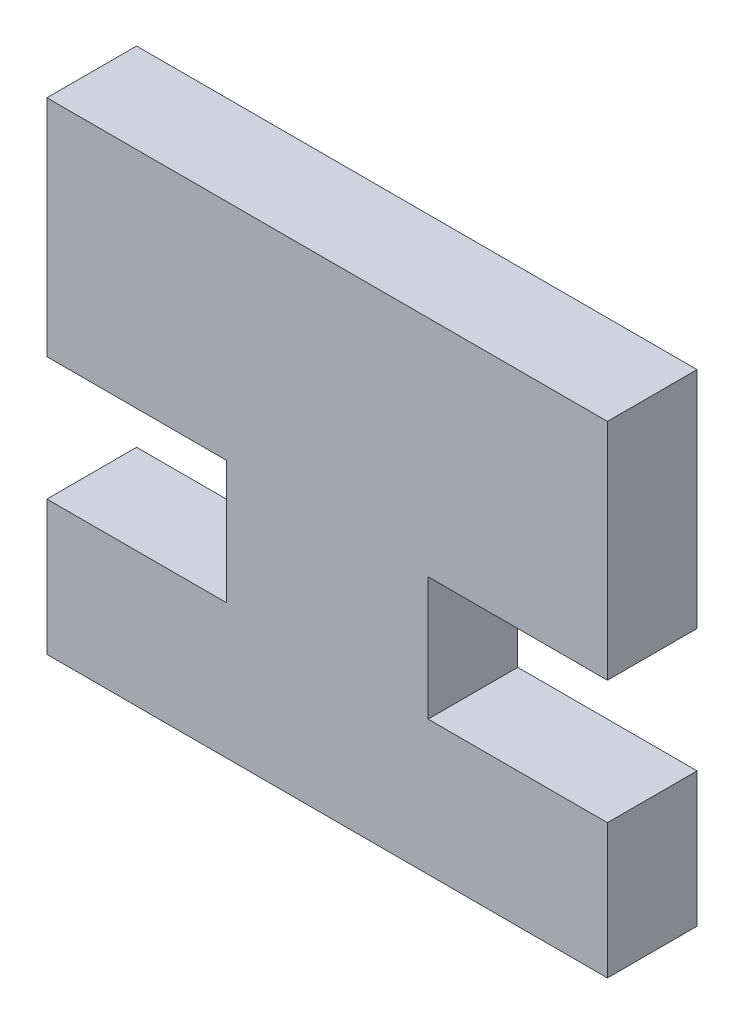
ISO-10303-21;
HEADER;
FILE_DESCRIPTION(('STEP AP214'),'2;1');
FILE_NAME('part.step','',(''),(''),'','','');
FILE_SCHEMA(('AUTOMOTIVE_DESIGN { 1 0 10303 214 1 1 1 1 }'));
ENDSEC;
DATA;
#1=APPLICATION_CONTEXT('core data for automotive mechanical design processes');
#2=APPLICATION_PROTOCOL_DEFINITION('international standard','automotive_design',2000,#1);
#3=PRODUCT_CONTEXT('',#1,'mechanical');
#4=PRODUCT('Part','Part','',(#3));
#5=PRODUCT_RELATED_PRODUCT_CATEGORY('part','',(#4));
#6=PRODUCT_DEFINITION_FORMATION('','',#4);
#7=PRODUCT_DEFINITION_CONTEXT('part definition',#1,'design');
#8=PRODUCT_DEFINITION('design','',#6,#7);
#9=PRODUCT_DEFINITION_SHAPE('','',#8);
#10=(LENGTH_UNIT() NAMED_UNIT(*) SI_UNIT(.MILLI.,.METRE.));
#11=(NAMED_UNIT(*) PLANE_ANGLE_UNIT() SI_UNIT($,.RADIAN.));
#12=(NAMED_UNIT(*) SI_UNIT($,.STERADIAN.) SOLID_ANGLE_UNIT());
#13=UNCERTAINTY_MEASURE_WITH_UNIT(LENGTH_MEASURE(1.E-05),#10,'distance_accuracy_value','');
#14=(GEOMETRIC_REPRESENTATION_CONTEXT(3) GLOBAL_UNCERTAINTY_ASSIGNED_CONTEXT((#13)) GLOBAL_UNIT_ASSIGNED_CONTEXT((#10,
#11,#12)) REPRESENTATION_CONTEXT('',''));
#15=CARTESIAN_POINT('',(0.,0.,0.));
#16=DIRECTION('',(0.,0.,1.));
#17=DIRECTION('',(1.,0.,0.));
#18=AXIS2_PLACEMENT_3D('',#15,#16,#17);
#19=CARTESIAN_POINT('',(-83.1719089808448,24.3044478848141,4.));
#20=DIRECTION('',(1.,0.,0.));
#21=DIRECTION('',(0.,0.,-1.));
#22=AXIS2_PLACEMENT_3D('',#19,#20,#21);
#23=PLANE('',#22);
#24=DIRECTION('',(0.,-1.,0.));
#25=VECTOR('',#24,1.);
#26=CARTESIAN_POINT('',(-83.1719089808448,24.3044478848141,0.));
#27=LINE('',#26,#25);
#28=CARTESIAN_POINT('',(-83.1719089808448,24.3044478848141,0.));
#29=VERTEX_POINT('',#28);
#30=CARTESIAN_POINT('',(-83.1719089808448,14.3044478848141,0.));
#31=VERTEX_POINT('',#30);
#32=EDGE_CURVE('E153',#29,#31,#27,.T.);
#33=ORIENTED_EDGE('',*,*,#32,.T.);
#34=DIRECTION('',(0.,0.,-1.));
#35=VECTOR('',#34,1.);
#36=CARTESIAN_POINT('',(-83.1719089808448,14.3044478848141,4.));
#37=LINE('',#36,#35);
#38=CARTESIAN_POINT('',(-83.1719089808448,14.3044478848141,4.));
#39=VERTEX_POINT('',#38);
#40=EDGE_CURVE('E11',#39,#31,#37,.T.);
#41=ORIENTED_EDGE('',*,*,#40,.F.);
#42=DIRECTION('',(0.,-1.,0.));
#43=VECTOR('',#42,1.);
#44=CARTESIAN_POINT('',(-83.1719089808448,24.3044478848141,4.));
#45=LINE('',#44,#43);
#46=CARTESIAN_POINT('',(-83.1719089808448,24.3044478848141,4.));
#47=VERTEX_POINT('',#46);
#48=EDGE_CURVE('E175',#47,#39,#45,.T.);
#49=ORIENTED_EDGE('',*,*,#48,.F.);
#50=DIRECTION('',(0.,0.,-1.));
#51=VECTOR('',#50,1.);
#52=CARTESIAN_POINT('',(-83.1719089808448,24.3044478848141,4.));
#53=LINE('',#52,#51);
#54=EDGE_CURVE('E149',#47,#29,#53,.T.);
#55=ORIENTED_EDGE('',*,*,#54,.T.);
#56=EDGE_LOOP('',(#33,#41,#49,#55));
#57=FACE_BOUND('',#56,.T.);
#58=ADVANCED_FACE('F33',(#57),#23,.F.);
#59=CARTESIAN_POINT('',(-83.1719089808448,14.3044478848141,4.));
#60=DIRECTION('',(0.,1.,0.));
#61=DIRECTION('',(0.,0.,1.));
#62=AXIS2_PLACEMENT_3D('',#59,#60,#61);
#63=PLANE('',#62);
#64=DIRECTION('',(1.,0.,0.));
#65=VECTOR('',#64,1.);
#66=CARTESIAN_POINT('',(-83.1719089808448,14.3044478848141,0.));
#67=LINE('',#66,#65);
#68=CARTESIAN_POINT('',(-75.1719089808448,14.3044478848141,0.));
#69=VERTEX_POINT('',#68);
#70=EDGE_CURVE('E156',#31,#69,#67,.T.);
#71=ORIENTED_EDGE('',*,*,#70,.T.);
#72=DIRECTION('',(0.,0.,-1.));
#73=VECTOR('',#72,1.);
#74=CARTESIAN_POINT('',(-75.1719089808448,14.3044478848141,4.));
#75=LINE('',#74,#73);
#76=CARTESIAN_POINT('',(-75.1719089808448,14.3044478848141,4.));
#77=VERTEX_POINT('',#76);
#78=EDGE_CURVE('E41',#77,#69,#75,.T.);
#79=ORIENTED_EDGE('',*,*,#78,.F.);
#80=DIRECTION('',(1.,0.,0.));
#81=VECTOR('',#80,1.);
#82=CARTESIAN_POINT('',(-83.1719089808448,14.3044478848141,4.));
#83=LINE('',#82,#81);
#84=EDGE_CURVE('E104',#39,#77,#83,.T.);
#85=ORIENTED_EDGE('',*,*,#84,.F.);
#86=ORIENTED_EDGE('',*,*,#40,.T.);
#87=EDGE_LOOP('',(#71,#79,#85,#86));
#88=FACE_BOUND('',#87,.T.);
#89=ADVANCED_FACE('F253',(#88),#63,.F.);
#90=CARTESIAN_POINT('',(-75.1719089808448,14.3044478848141,4.));
#91=DIRECTION('',(1.,0.,0.));
#92=DIRECTION('',(0.,0.,-1.));
#93=AXIS2_PLACEMENT_3D('',#90,#91,#92);
#94=PLANE('',#93);
#95=DIRECTION('',(0.,-1.,0.));
#96=VECTOR('',#95,1.);
#97=CARTESIAN_POINT('',(-75.1719089808448,14.3044478848141,0.));
#98=LINE('',#97,#96);
#99=CARTESIAN_POINT('',(-75.1719089808448,8.80444788481406,0.));
#100=VERTEX_POINT('',#99);
#101=EDGE_CURVE('E158',#69,#100,#98,.T.);
#102=ORIENTED_EDGE('',*,*,#101,.T.);
#103=DIRECTION('',(0.,0.,-1.));
#104=VECTOR('',#103,1.);
#105=CARTESIAN_POINT('',(-75.1719089808448,8.80444788481406,4.));
#106=LINE('',#105,#104);
#107=CARTESIAN_POINT('',(-75.1719089808448,8.80444788481406,4.));
#108=VERTEX_POINT('',#107);
#109=EDGE_CURVE('E194',#108,#100,#106,.T.);
#110=ORIENTED_EDGE('',*,*,#109,.F.);
#111=DIRECTION('',(0.,-1.,0.));
#112=VECTOR('',#111,1.);
#113=CARTESIAN_POINT('',(-75.1719089808448,14.3044478848141,4.));
#114=LINE('',#113,#112);
#115=EDGE_CURVE('E202',#77,#108,#114,.T.);
#116=ORIENTED_EDGE('',*,*,#115,.F.);
#117=ORIENTED_EDGE('',*,*,#78,.T.);
#118=EDGE_LOOP('',(#102,#110,#116,#117));
#119=FACE_BOUND('',#118,.T.);
#120=ADVANCED_FACE('F200',(#119),#94,.F.);
#121=CARTESIAN_POINT('',(-83.1719089808448,8.80444788481406,4.));
#122=DIRECTION('',(0.,-1.,0.));
#123=DIRECTION('',(0.,0.,-1.));
#124=AXIS2_PLACEMENT_3D('',#121,#122,#123);
#125=PLANE('',#124);
#126=DIRECTION('',(-1.,0.,0.));
#127=VECTOR('',#126,1.);
#128=CARTESIAN_POINT('',(-83.1719089808448,8.80444788481406,0.));
#129=LINE('',#128,#127);
#130=CARTESIAN_POINT('',(-83.1719089808448,8.80444788481406,0.));
#131=VERTEX_POINT('',#130);
#132=EDGE_CURVE('E160',#100,#131,#129,.T.);
#133=ORIENTED_EDGE('',*,*,#132,.T.);
#134=DIRECTION('',(0.,0.,-1.));
#135=VECTOR('',#134,1.);
#136=CARTESIAN_POINT('',(-83.1719089808448,8.80444788481406,4.));
#137=LINE('',#136,#135);
#138=CARTESIAN_POINT('',(-83.1719089808448,8.80444788481406,4.));
#139=VERTEX_POINT('',#138);
#140=EDGE_CURVE('E191',#139,#131,#137,.T.);
#141=ORIENTED_EDGE('',*,*,#140,.F.);
#142=DIRECTION('',(-1.,0.,0.));
#143=VECTOR('',#142,1.);
#144=CARTESIAN_POINT('',(-83.1719089808448,8.80444788481406,4.));
#145=LINE('',#144,#143);
#146=EDGE_CURVE('E220',#108,#139,#145,.T.);
#147=ORIENTED_EDGE('',*,*,#146,.F.);
#148=ORIENTED_EDGE('',*,*,#109,.T.);
#149=EDGE_LOOP('',(#133,#141,#147,#148));
#150=FACE_BOUND('',#149,.T.);
#151=ADVANCED_FACE('F211',(#150),#125,.F.);
#152=CARTESIAN_POINT('',(-83.1719089808448,8.80444788481406,4.));
#153=DIRECTION('',(1.,0.,0.));
#154=DIRECTION('',(0.,0.,-1.));
#155=AXIS2_PLACEMENT_3D('',#152,#153,#154);
#156=PLANE('',#155);
#157=DIRECTION('',(0.,-1.,0.));
#158=VECTOR('',#157,1.);
#159=CARTESIAN_POINT('',(-83.1719089808448,8.80444788481406,0.));
#160=LINE('',#159,#158);
#161=CARTESIAN_POINT('',(-83.1719089808448,2.80444788481406,0.));
#162=VERTEX_POINT('',#161);
#163=EDGE_CURVE('E162',#131,#162,#160,.T.);
#164=ORIENTED_EDGE('',*,*,#163,.T.);
#165=DIRECTION('',(0.,0.,-1.));
#166=VECTOR('',#165,1.);
#167=CARTESIAN_POINT('',(-83.1719089808448,2.80444788481406,4.));
#168=LINE('',#167,#166);
#169=CARTESIAN_POINT('',(-83.1719089808448,2.80444788481406,4.));
#170=VERTEX_POINT('',#169);
#171=EDGE_CURVE('E188',#170,#162,#168,.T.);
#172=ORIENTED_EDGE('',*,*,#171,.F.);
#173=DIRECTION('',(0.,-1.,0.));
#174=VECTOR('',#173,1.);
#175=CARTESIAN_POINT('',(-83.1719089808448,8.80444788481406,4.));
#176=LINE('',#175,#174);
#177=EDGE_CURVE('E217',#139,#170,#176,.T.);
#178=ORIENTED_EDGE('',*,*,#177,.F.);
#179=ORIENTED_EDGE('',*,*,#140,.T.);
#180=EDGE_LOOP('',(#164,#172,#178,#179));
#181=FACE_BOUND('',#180,.T.);
#182=ADVANCED_FACE('F215',(#181),#156,.F.);
#183=CARTESIAN_POINT('',(-83.1719089808448,2.80444788481406,4.));
#184=DIRECTION('',(0.,1.,0.));
#185=DIRECTION('',(0.,0.,1.));
#186=AXIS2_PLACEMENT_3D('',#183,#184,#185);
#187=PLANE('',#186);
#188=DIRECTION('',(1.,0.,0.));
#189=VECTOR('',#188,1.);
#190=CARTESIAN_POINT('',(-83.1719089808448,2.80444788481406,0.));
#191=LINE('',#190,#189);
#192=CARTESIAN_POINT('',(-58.1719089808448,2.80444788481406,0.));
#193=VERTEX_POINT('',#192);
#194=EDGE_CURVE('E164',#162,#193,#191,.T.);
#195=ORIENTED_EDGE('',*,*,#194,.T.);
#196=DIRECTION('',(0.,0.,-1.));
#197=VECTOR('',#196,1.);
#198=CARTESIAN_POINT('',(-58.1719089808448,2.80444788481406,4.));
#199=LINE('',#198,#197);
#200=CARTESIAN_POINT('',(-58.1719089808448,2.80444788481406,4.));
#201=VERTEX_POINT('',#200);
#202=EDGE_CURVE('E185',#201,#193,#199,.T.);
#203=ORIENTED_EDGE('',*,*,#202,.F.);
#204=DIRECTION('',(1.,0.,0.));
#205=VECTOR('',#204,1.);
#206=CARTESIAN_POINT('',(-83.1719089808448,2.80444788481406,4.));
#207=LINE('',#206,#205);
#208=EDGE_CURVE('E219',#170,#201,#207,.T.);
#209=ORIENTED_EDGE('',*,*,#208,.F.);
#210=ORIENTED_EDGE('',*,*,#171,.T.);
#211=EDGE_LOOP('',(#195,#203,#209,#210));
#212=FACE_BOUND('',#211,.T.);
#213=ADVANCED_FACE('F266',(#212),#187,.F.);
#214=CARTESIAN_POINT('',(-58.1719089808448,8.80444788481406,4.));
#215=DIRECTION('',(-1.,0.,0.));
#216=DIRECTION('',(0.,0.,1.));
#217=AXIS2_PLACEMENT_3D('',#214,#215,#216);
#218=PLANE('',#217);
#219=DIRECTION('',(0.,1.,0.));
#220=VECTOR('',#219,1.);
#221=CARTESIAN_POINT('',(-58.1719089808448,8.80444788481406,0.));
#222=LINE('',#221,#220);
#223=CARTESIAN_POINT('',(-58.1719089808448,8.80444788481406,0.));
#224=VERTEX_POINT('',#223);
#225=EDGE_CURVE('E166',#193,#224,#222,.T.);
#226=ORIENTED_EDGE('',*,*,#225,.T.);
#227=DIRECTION('',(0.,0.,-1.));
#228=VECTOR('',#227,1.);
#229=CARTESIAN_POINT('',(-58.1719089808448,8.80444788481406,4.));
#230=LINE('',#229,#228);
#231=CARTESIAN_POINT('',(-58.1719089808448,8.80444788481406,4.));
#232=VERTEX_POINT('',#231);
#233=EDGE_CURVE('E182',#232,#224,#230,.T.);
#234=ORIENTED_EDGE('',*,*,#233,.F.);
#235=DIRECTION('',(0.,1.,0.));
#236=VECTOR('',#235,1.);
#237=CARTESIAN_POINT('',(-58.1719089808448,8.80444788481406,4.));
#238=LINE('',#237,#236);
#239=EDGE_CURVE('E222',#201,#232,#238,.T.);
#240=ORIENTED_EDGE('',*,*,#239,.F.);
#241=ORIENTED_EDGE('',*,*,#202,.T.);
#242=EDGE_LOOP('',(#226,#234,#240,#241));
#243=FACE_BOUND('',#242,.T.);
#244=ADVANCED_FACE('F269',(#243),#218,.F.);
#245=CARTESIAN_POINT('',(-66.1719089808448,8.80444788481406,4.));
#246=DIRECTION('',(0.,-1.,0.));
#247=DIRECTION('',(0.,0.,-1.));
#248=AXIS2_PLACEMENT_3D('',#245,#246,#247);
#249=PLANE('',#248);
#250=DIRECTION('',(-1.,0.,0.));
#251=VECTOR('',#250,1.);
#252=CARTESIAN_POINT('',(-66.1719089808448,8.80444788481406,0.));
#253=LINE('',#252,#251);
#254=CARTESIAN_POINT('',(-66.1719089808448,8.80444788481406,0.));
#255=VERTEX_POINT('',#254);
#256=EDGE_CURVE('E168',#224,#255,#253,.T.);
#257=ORIENTED_EDGE('',*,*,#256,.T.);
#258=DIRECTION('',(0.,0.,-1.));
#259=VECTOR('',#258,1.);
#260=CARTESIAN_POINT('',(-66.1719089808448,8.80444788481406,4.));
#261=LINE('',#260,#259);
#262=CARTESIAN_POINT('',(-66.1719089808448,8.80444788481406,4.));
#263=VERTEX_POINT('',#262);
#264=EDGE_CURVE('E179',#263,#255,#261,.T.);
#265=ORIENTED_EDGE('',*,*,#264,.F.);
#266=DIRECTION('',(-1.,0.,0.));
#267=VECTOR('',#266,1.);
#268=CARTESIAN_POINT('',(-66.1719089808448,8.80444788481406,4.));
#269=LINE('',#268,#267);
#270=EDGE_CURVE('E228',#232,#263,#269,.T.);
#271=ORIENTED_EDGE('',*,*,#270,.F.);
#272=ORIENTED_EDGE('',*,*,#233,.T.);
#273=EDGE_LOOP('',(#257,#265,#271,#272));
#274=FACE_BOUND('',#273,.T.);
#275=ADVANCED_FACE('F234',(#274),#249,.F.);
#276=CARTESIAN_POINT('',(-66.1719089808448,14.3044478848141,4.));
#277=DIRECTION('',(-1.,0.,0.));
#278=DIRECTION('',(0.,0.,1.));
#279=AXIS2_PLACEMENT_3D('',#276,#277,#278);
#280=PLANE('',#279);
#281=DIRECTION('',(0.,1.,0.));
#282=VECTOR('',#281,1.);
#283=CARTESIAN_POINT('',(-66.1719089808448,14.3044478848141,0.));
#284=LINE('',#283,#282);
#285=CARTESIAN_POINT('',(-66.1719089808448,14.3044478848141,0.));
#286=VERTEX_POINT('',#285);
#287=EDGE_CURVE('E170',#255,#286,#284,.T.);
#288=ORIENTED_EDGE('',*,*,#287,.T.);
#289=DIRECTION('',(0.,0.,-1.));
#290=VECTOR('',#289,1.);
#291=CARTESIAN_POINT('',(-66.1719089808448,14.3044478848141,4.));
#292=LINE('',#291,#290);
#293=CARTESIAN_POINT('',(-66.1719089808448,14.3044478848141,4.));
#294=VERTEX_POINT('',#293);
#295=EDGE_CURVE('E144',#294,#286,#292,.T.);
#296=ORIENTED_EDGE('',*,*,#295,.F.);
#297=DIRECTION('',(0.,1.,0.));
#298=VECTOR('',#297,1.);
#299=CARTESIAN_POINT('',(-66.1719089808448,14.3044478848141,4.));
#300=LINE('',#299,#298);
#301=EDGE_CURVE('E135',#263,#294,#300,.T.);
#302=ORIENTED_EDGE('',*,*,#301,.F.);
#303=ORIENTED_EDGE('',*,*,#264,.T.);
#304=EDGE_LOOP('',(#288,#296,#302,#303));
#305=FACE_BOUND('',#304,.T.);
#306=ADVANCED_FACE('F238',(#305),#280,.F.);
#307=CARTESIAN_POINT('',(-66.1719089808448,14.3044478848141,4.));
#308=DIRECTION('',(0.,1.,0.));
#309=DIRECTION('',(0.,0.,1.));
#310=AXIS2_PLACEMENT_3D('',#307,#308,#309);
#311=PLANE('',#310);
#312=DIRECTION('',(1.,0.,0.));
#313=VECTOR('',#312,1.);
#314=CARTESIAN_POINT('',(-66.1719089808448,14.3044478848141,0.));
#315=LINE('',#314,#313);
#316=CARTESIAN_POINT('',(-58.1719089808448,14.3044478848141,0.));
#317=VERTEX_POINT('',#316);
#318=EDGE_CURVE('E143',#286,#317,#315,.T.);
#319=ORIENTED_EDGE('',*,*,#318,.T.);
#320=DIRECTION('',(0.,0.,-1.));
#321=VECTOR('',#320,1.);
#322=CARTESIAN_POINT('',(-58.1719089808448,14.3044478848141,4.));
#323=LINE('',#322,#321);
#324=CARTESIAN_POINT('',(-58.1719089808448,14.3044478848141,4.));
#325=VERTEX_POINT('',#324);
#326=EDGE_CURVE('E140',#325,#317,#323,.T.);
#327=ORIENTED_EDGE('',*,*,#326,.F.);
#328=DIRECTION('',(1.,0.,0.));
#329=VECTOR('',#328,1.);
#330=CARTESIAN_POINT('',(-66.1719089808448,14.3044478848141,4.));
#331=LINE('',#330,#329);
#332=EDGE_CURVE('E129',#294,#325,#331,.T.);
#333=ORIENTED_EDGE('',*,*,#332,.F.);
#334=ORIENTED_EDGE('',*,*,#295,.T.);
#335=EDGE_LOOP('',(#319,#327,#333,#334));
#336=FACE_BOUND('',#335,.T.);
#337=ADVANCED_FACE('F141',(#336),#311,.F.);
#338=CARTESIAN_POINT('',(-58.1719089808448,14.3044478848141,4.));
#339=DIRECTION('',(-1.,0.,0.));
#340=DIRECTION('',(0.,0.,1.));
#341=AXIS2_PLACEMENT_3D('',#338,#339,#340);
#342=PLANE('',#341);
#343=DIRECTION('',(0.,1.,0.));
#344=VECTOR('',#343,1.);
#345=CARTESIAN_POINT('',(-58.1719089808448,14.3044478848141,0.));
#346=LINE('',#345,#344);
#347=CARTESIAN_POINT('',(-58.1719089808448,24.3044478848141,0.));
#348=VERTEX_POINT('',#347);
#349=EDGE_CURVE('E90',#317,#348,#346,.T.);
#350=ORIENTED_EDGE('',*,*,#349,.T.);
#351=DIRECTION('',(0.,0.,-1.));
#352=VECTOR('',#351,1.);
#353=CARTESIAN_POINT('',(-58.1719089808448,24.3044478848141,4.));
#354=LINE('',#353,#352);
#355=CARTESIAN_POINT('',(-58.1719089808448,24.3044478848141,4.));
#356=VERTEX_POINT('',#355);
#357=EDGE_CURVE('E145',#356,#348,#354,.T.);
#358=ORIENTED_EDGE('',*,*,#357,.F.);
#359=DIRECTION('',(0.,1.,0.));
#360=VECTOR('',#359,1.);
#361=CARTESIAN_POINT('',(-58.1719089808448,14.3044478848141,4.));
#362=LINE('',#361,#360);
#363=EDGE_CURVE('E133',#325,#356,#362,.T.);
#364=ORIENTED_EDGE('',*,*,#363,.F.);
#365=ORIENTED_EDGE('',*,*,#326,.T.);
#366=EDGE_LOOP('',(#350,#358,#364,#365));
#367=FACE_BOUND('',#366,.T.);
#368=ADVANCED_FACE('F147',(#367),#342,.F.);
#369=CARTESIAN_POINT('',(-83.1719089808448,24.3044478848141,4.));
#370=DIRECTION('',(0.,-1.,0.));
#371=DIRECTION('',(0.,0.,-1.));
#372=AXIS2_PLACEMENT_3D('',#369,#370,#371);
#373=PLANE('',#372);
#374=DIRECTION('',(-1.,0.,0.));
#375=VECTOR('',#374,1.);
#376=CARTESIAN_POINT('',(-83.1719089808448,24.3044478848141,0.));
#377=LINE('',#376,#375);
#378=EDGE_CURVE('E96',#348,#29,#377,.T.);
#379=ORIENTED_EDGE('',*,*,#378,.T.);
#380=ORIENTED_EDGE('',*,*,#54,.F.);
#381=DIRECTION('',(-1.,0.,0.));
#382=VECTOR('',#381,1.);
#383=CARTESIAN_POINT('',(-83.1719089808448,24.3044478848141,4.));
#384=LINE('',#383,#382);
#385=EDGE_CURVE('E49',#356,#47,#384,.T.);
#386=ORIENTED_EDGE('',*,*,#385,.F.);
#387=ORIENTED_EDGE('',*,*,#357,.T.);
#388=EDGE_LOOP('',(#379,#380,#386,#387));
#389=FACE_BOUND('',#388,.T.);
#390=ADVANCED_FACE('F242',(#389),#373,.F.);
#391=CARTESIAN_POINT('',(0.,0.,4.));
#392=DIRECTION('',(0.,0.,1.));
#393=DIRECTION('',(1.,0.,0.));
#394=AXIS2_PLACEMENT_3D('',#391,#392,#393);
#395=PLANE('',#394);
#396=ORIENTED_EDGE('',*,*,#48,.T.);
#397=ORIENTED_EDGE('',*,*,#84,.T.);
#398=ORIENTED_EDGE('',*,*,#115,.T.);
#399=ORIENTED_EDGE('',*,*,#146,.T.);
#400=ORIENTED_EDGE('',*,*,#177,.T.);
#401=ORIENTED_EDGE('',*,*,#208,.T.);
#402=ORIENTED_EDGE('',*,*,#239,.T.);
#403=ORIENTED_EDGE('',*,*,#270,.T.);
#404=ORIENTED_EDGE('',*,*,#301,.T.);
#405=ORIENTED_EDGE('',*,*,#332,.T.);
#406=ORIENTED_EDGE('',*,*,#363,.T.);
#407=ORIENTED_EDGE('',*,*,#385,.T.);
#408=EDGE_LOOP('',(#396,#397,#398,#399,#400,#401,#402,#403,#404,#405,#406,#407));
#409=FACE_BOUND('',#408,.T.);
#410=ADVANCED_FACE('F131',(#409),#395,.T.);
#411=CARTESIAN_POINT('',(0.,0.,0.));
#412=DIRECTION('',(0.,0.,1.));
#413=DIRECTION('',(1.,0.,0.));
#414=AXIS2_PLACEMENT_3D('',#411,#412,#413);
#415=PLANE('',#414);
#416=ORIENTED_EDGE('',*,*,#32,.F.);
#417=ORIENTED_EDGE('',*,*,#378,.F.);
#418=ORIENTED_EDGE('',*,*,#349,.F.);
#419=ORIENTED_EDGE('',*,*,#318,.F.);
#420=ORIENTED_EDGE('',*,*,#287,.F.);
#421=ORIENTED_EDGE('',*,*,#256,.F.);
#422=ORIENTED_EDGE('',*,*,#225,.F.);
#423=ORIENTED_EDGE('',*,*,#194,.F.);
#424=ORIENTED_EDGE('',*,*,#163,.F.);
#425=ORIENTED_EDGE('',*,*,#132,.F.);
#426=ORIENTED_EDGE('',*,*,#101,.F.);
#427=ORIENTED_EDGE('',*,*,#70,.F.);
#428=EDGE_LOOP('',(#416,#417,#418,#419,#420,#421,#422,#423,#424,#425,#426,#427));
#429=FACE_BOUND('',#428,.T.);
#430=ADVANCED_FACE('F206',(#429),#415,.F.);
#431=CLOSED_SHELL('',(#58,#89,#120,#151,#182,#213,#244,#275,#306,#337,#368,#390,#410,#430));
#432=MANIFOLD_SOLID_BREP('B2',#431);
#433=ADVANCED_BREP_SHAPE_REPRESENTATION('',(#18,#432),#14);
#434=SHAPE_DEFINITION_REPRESENTATION(#9,#433);
ENDSEC;
END-ISO-10303-21;
